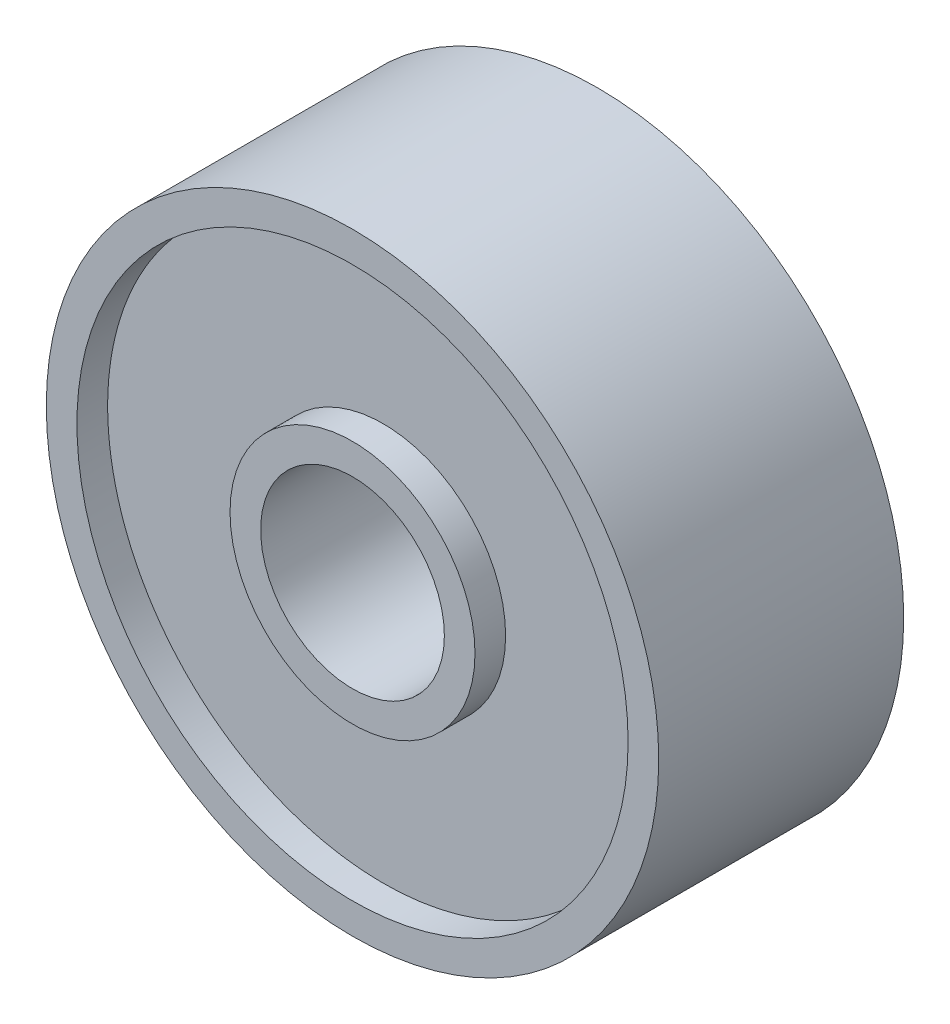
ISO-10303-21;
HEADER;
FILE_DESCRIPTION(('STEP AP214'),'2;1');
FILE_NAME('part.step','',(''),(''),'','','');
FILE_SCHEMA(('AUTOMOTIVE_DESIGN { 1 0 10303 214 1 1 1 1 }'));
ENDSEC;
DATA;
#1=APPLICATION_CONTEXT('core data for automotive mechanical design processes');
#2=APPLICATION_PROTOCOL_DEFINITION('international standard','automotive_design',2000,#1);
#3=PRODUCT_CONTEXT('',#1,'mechanical');
#4=PRODUCT('Part','Part','',(#3));
#5=PRODUCT_RELATED_PRODUCT_CATEGORY('part','',(#4));
#6=PRODUCT_DEFINITION_FORMATION('','',#4);
#7=PRODUCT_DEFINITION_CONTEXT('part definition',#1,'design');
#8=PRODUCT_DEFINITION('design','',#6,#7);
#9=PRODUCT_DEFINITION_SHAPE('','',#8);
#10=(LENGTH_UNIT() NAMED_UNIT(*) SI_UNIT(.MILLI.,.METRE.));
#11=(NAMED_UNIT(*) PLANE_ANGLE_UNIT() SI_UNIT($,.RADIAN.));
#12=(NAMED_UNIT(*) SI_UNIT($,.STERADIAN.) SOLID_ANGLE_UNIT());
#13=UNCERTAINTY_MEASURE_WITH_UNIT(LENGTH_MEASURE(1.E-05),#10,'distance_accuracy_value','');
#14=(GEOMETRIC_REPRESENTATION_CONTEXT(3) GLOBAL_UNCERTAINTY_ASSIGNED_CONTEXT((#13)) GLOBAL_UNIT_ASSIGNED_CONTEXT((#10,
#11,#12)) REPRESENTATION_CONTEXT('',''));
#15=CARTESIAN_POINT('',(0.,0.,0.));
#16=DIRECTION('',(0.,0.,1.));
#17=DIRECTION('',(1.,0.,0.));
#18=AXIS2_PLACEMENT_3D('',#15,#16,#17);
#19=CARTESIAN_POINT('',(0.,0.,4.));
#20=DIRECTION('',(0.,0.,-1.));
#21=DIRECTION('',(-1.,0.,0.));
#22=AXIS2_PLACEMENT_3D('',#19,#20,#21);
#23=CYLINDRICAL_SURFACE('',#22,2.);
#24=CARTESIAN_POINT('',(0.,0.,0.499988));
#25=DIRECTION('',(0.,0.,-1.));
#26=DIRECTION('',(-1.,0.,0.));
#27=AXIS2_PLACEMENT_3D('',#24,#25,#26);
#28=CIRCLE('',#27,2.);
#29=CARTESIAN_POINT('',(-2.,0.,0.499988));
#30=VERTEX_POINT('',#29);
#31=EDGE_CURVE('E12',#30,#30,#28,.F.);
#32=ORIENTED_EDGE('',*,*,#31,.F.);
#33=EDGE_LOOP('',(#32));
#34=FACE_BOUND('',#33,.T.);
#35=CARTESIAN_POINT('',(0.,0.,3.5));
#36=DIRECTION('',(0.,0.,1.));
#37=DIRECTION('',(1.,0.,0.));
#38=AXIS2_PLACEMENT_3D('',#35,#36,#37);
#39=CIRCLE('',#38,2.);
#40=CARTESIAN_POINT('',(2.,0.,3.5));
#41=VERTEX_POINT('',#40);
#42=EDGE_CURVE('E63',#41,#41,#39,.F.);
#43=ORIENTED_EDGE('',*,*,#42,.F.);
#44=EDGE_LOOP('',(#43));
#45=FACE_BOUND('',#44,.T.);
#46=ADVANCED_FACE('F53',(#34,#45),#23,.F.);
#47=CARTESIAN_POINT('',(0.,0.,4.));
#48=DIRECTION('',(0.,0.,-1.));
#49=DIRECTION('',(-1.,0.,0.));
#50=AXIS2_PLACEMENT_3D('',#47,#48,#49);
#51=CYLINDRICAL_SURFACE('',#50,4.5);
#52=CARTESIAN_POINT('',(0.,0.,0.499988));
#53=DIRECTION('',(0.,0.,-1.));
#54=DIRECTION('',(-1.,0.,0.));
#55=AXIS2_PLACEMENT_3D('',#52,#53,#54);
#56=CIRCLE('',#55,4.5);
#57=CARTESIAN_POINT('',(-4.5,0.,0.499988));
#58=VERTEX_POINT('',#57);
#59=EDGE_CURVE('E59',#58,#58,#56,.T.);
#60=ORIENTED_EDGE('',*,*,#59,.F.);
#61=EDGE_LOOP('',(#60));
#62=FACE_BOUND('',#61,.T.);
#63=CARTESIAN_POINT('',(0.,0.,3.5));
#64=DIRECTION('',(0.,0.,1.));
#65=DIRECTION('',(1.,0.,0.));
#66=AXIS2_PLACEMENT_3D('',#63,#64,#65);
#67=CIRCLE('',#66,4.5);
#68=CARTESIAN_POINT('',(4.5,0.,3.5));
#69=VERTEX_POINT('',#68);
#70=EDGE_CURVE('E67',#69,#69,#67,.T.);
#71=ORIENTED_EDGE('',*,*,#70,.F.);
#72=EDGE_LOOP('',(#71));
#73=FACE_BOUND('',#72,.T.);
#74=ADVANCED_FACE('F76',(#62,#73),#51,.T.);
#75=CARTESIAN_POINT('',(0.,0.,0.499988));
#76=DIRECTION('',(0.,0.,-1.));
#77=DIRECTION('',(-1.,0.,0.));
#78=AXIS2_PLACEMENT_3D('',#75,#76,#77);
#79=PLANE('',#78);
#80=ORIENTED_EDGE('',*,*,#59,.T.);
#81=EDGE_LOOP('',(#80));
#82=FACE_BOUND('',#81,.T.);
#83=ORIENTED_EDGE('',*,*,#31,.T.);
#84=EDGE_LOOP('',(#83));
#85=FACE_BOUND('',#84,.T.);
#86=ADVANCED_FACE('F78',(#82,#85),#79,.T.);
#87=CARTESIAN_POINT('',(0.,0.,3.5));
#88=DIRECTION('',(0.,0.,1.));
#89=DIRECTION('',(1.,0.,0.));
#90=AXIS2_PLACEMENT_3D('',#87,#88,#89);
#91=PLANE('',#90);
#92=ORIENTED_EDGE('',*,*,#70,.T.);
#93=EDGE_LOOP('',(#92));
#94=FACE_BOUND('',#93,.T.);
#95=ORIENTED_EDGE('',*,*,#42,.T.);
#96=EDGE_LOOP('',(#95));
#97=FACE_BOUND('',#96,.T.);
#98=ADVANCED_FACE('F73',(#94,#97),#91,.T.);
#99=CLOSED_SHELL('',(#46,#74,#86,#98));
#100=MANIFOLD_SOLID_BREP('B2',#99);
#101=CARTESIAN_POINT('',(0.,0.,4.));
#102=DIRECTION('',(0.,0.,-1.));
#103=DIRECTION('',(-1.,0.,0.));
#104=AXIS2_PLACEMENT_3D('',#101,#102,#103);
#105=CYLINDRICAL_SURFACE('',#104,1.5);
#106=CARTESIAN_POINT('',(0.,0.,4.));
#107=DIRECTION('',(0.,0.,1.));
#108=DIRECTION('',(1.,0.,0.));
#109=AXIS2_PLACEMENT_3D('',#106,#107,#108);
#110=CIRCLE('',#109,1.5);
#111=CARTESIAN_POINT('',(1.5,0.,4.));
#112=VERTEX_POINT('',#111);
#113=EDGE_CURVE('E132',#112,#112,#110,.T.);
#114=ORIENTED_EDGE('',*,*,#113,.T.);
#115=EDGE_LOOP('',(#114));
#116=FACE_BOUND('',#115,.T.);
#117=CARTESIAN_POINT('',(0.,0.,0.));
#118=DIRECTION('',(0.,0.,1.));
#119=DIRECTION('',(1.,0.,0.));
#120=AXIS2_PLACEMENT_3D('',#117,#118,#119);
#121=CIRCLE('',#120,1.5);
#122=CARTESIAN_POINT('',(1.5,0.,0.));
#123=VERTEX_POINT('',#122);
#124=EDGE_CURVE('E138',#123,#123,#121,.T.);
#125=ORIENTED_EDGE('',*,*,#124,.F.);
#126=EDGE_LOOP('',(#125));
#127=FACE_BOUND('',#126,.T.);
#128=ADVANCED_FACE('F125',(#116,#127),#105,.F.);
#129=CARTESIAN_POINT('',(0.,0.,4.));
#130=DIRECTION('',(0.,0.,-1.));
#131=DIRECTION('',(-1.,0.,0.));
#132=AXIS2_PLACEMENT_3D('',#129,#130,#131);
#133=CYLINDRICAL_SURFACE('',#132,2.);
#134=CARTESIAN_POINT('',(0.,0.,4.));
#135=DIRECTION('',(0.,0.,1.));
#136=DIRECTION('',(1.,0.,0.));
#137=AXIS2_PLACEMENT_3D('',#134,#135,#136);
#138=CIRCLE('',#137,2.);
#139=CARTESIAN_POINT('',(2.,0.,4.));
#140=VERTEX_POINT('',#139);
#141=EDGE_CURVE('E52',#140,#140,#138,.T.);
#142=ORIENTED_EDGE('',*,*,#141,.F.);
#143=EDGE_LOOP('',(#142));
#144=FACE_BOUND('',#143,.T.);
#145=CARTESIAN_POINT('',(0.,0.,0.));
#146=DIRECTION('',(0.,0.,1.));
#147=DIRECTION('',(1.,0.,0.));
#148=AXIS2_PLACEMENT_3D('',#145,#146,#147);
#149=CIRCLE('',#148,2.);
#150=CARTESIAN_POINT('',(2.,0.,0.));
#151=VERTEX_POINT('',#150);
#152=EDGE_CURVE('E128',#151,#151,#149,.T.);
#153=ORIENTED_EDGE('',*,*,#152,.T.);
#154=EDGE_LOOP('',(#153));
#155=FACE_BOUND('',#154,.T.);
#156=ADVANCED_FACE('F145',(#144,#155),#133,.T.);
#157=CARTESIAN_POINT('',(0.,0.,4.));
#158=DIRECTION('',(0.,0.,1.));
#159=DIRECTION('',(1.,0.,0.));
#160=AXIS2_PLACEMENT_3D('',#157,#158,#159);
#161=PLANE('',#160);
#162=ORIENTED_EDGE('',*,*,#113,.F.);
#163=EDGE_LOOP('',(#162));
#164=FACE_BOUND('',#163,.T.);
#165=ORIENTED_EDGE('',*,*,#141,.T.);
#166=EDGE_LOOP('',(#165));
#167=FACE_BOUND('',#166,.T.);
#168=ADVANCED_FACE('F149',(#164,#167),#161,.T.);
#169=CARTESIAN_POINT('',(0.,0.,0.));
#170=DIRECTION('',(0.,0.,1.));
#171=DIRECTION('',(1.,0.,0.));
#172=AXIS2_PLACEMENT_3D('',#169,#170,#171);
#173=PLANE('',#172);
#174=ORIENTED_EDGE('',*,*,#124,.T.);
#175=EDGE_LOOP('',(#174));
#176=FACE_BOUND('',#175,.T.);
#177=ORIENTED_EDGE('',*,*,#152,.F.);
#178=EDGE_LOOP('',(#177));
#179=FACE_BOUND('',#178,.T.);
#180=ADVANCED_FACE('F147',(#176,#179),#173,.F.);
#181=CLOSED_SHELL('',(#128,#156,#168,#180));
#182=MANIFOLD_SOLID_BREP('B7',#181);
#183=CARTESIAN_POINT('',(0.,0.,4.));
#184=DIRECTION('',(0.,0.,-1.));
#185=DIRECTION('',(-1.,0.,0.));
#186=AXIS2_PLACEMENT_3D('',#183,#184,#185);
#187=CYLINDRICAL_SURFACE('',#186,4.5);
#188=CARTESIAN_POINT('',(0.,0.,4.));
#189=DIRECTION('',(0.,0.,1.));
#190=DIRECTION('',(1.,0.,0.));
#191=AXIS2_PLACEMENT_3D('',#188,#189,#190);
#192=CIRCLE('',#191,4.5);
#193=CARTESIAN_POINT('',(4.5,0.,4.));
#194=VERTEX_POINT('',#193);
#195=EDGE_CURVE('E193',#194,#194,#192,.T.);
#196=ORIENTED_EDGE('',*,*,#195,.T.);
#197=EDGE_LOOP('',(#196));
#198=FACE_BOUND('',#197,.T.);
#199=CARTESIAN_POINT('',(0.,0.,0.));
#200=DIRECTION('',(0.,0.,1.));
#201=DIRECTION('',(1.,0.,0.));
#202=AXIS2_PLACEMENT_3D('',#199,#200,#201);
#203=CIRCLE('',#202,4.5);
#204=CARTESIAN_POINT('',(4.5,0.,0.));
#205=VERTEX_POINT('',#204);
#206=EDGE_CURVE('E199',#205,#205,#203,.T.);
#207=ORIENTED_EDGE('',*,*,#206,.F.);
#208=EDGE_LOOP('',(#207));
#209=FACE_BOUND('',#208,.T.);
#210=ADVANCED_FACE('F186',(#198,#209),#187,.F.);
#211=CARTESIAN_POINT('',(0.,0.,4.));
#212=DIRECTION('',(0.,0.,-1.));
#213=DIRECTION('',(-1.,0.,0.));
#214=AXIS2_PLACEMENT_3D('',#211,#212,#213);
#215=CYLINDRICAL_SURFACE('',#214,5.);
#216=CARTESIAN_POINT('',(0.,0.,4.));
#217=DIRECTION('',(0.,0.,1.));
#218=DIRECTION('',(1.,0.,0.));
#219=AXIS2_PLACEMENT_3D('',#216,#217,#218);
#220=CIRCLE('',#219,5.);
#221=CARTESIAN_POINT('',(5.,0.,4.));
#222=VERTEX_POINT('',#221);
#223=EDGE_CURVE('E124',#222,#222,#220,.T.);
#224=ORIENTED_EDGE('',*,*,#223,.F.);
#225=EDGE_LOOP('',(#224));
#226=FACE_BOUND('',#225,.T.);
#227=CARTESIAN_POINT('',(0.,0.,0.));
#228=DIRECTION('',(0.,0.,1.));
#229=DIRECTION('',(1.,0.,0.));
#230=AXIS2_PLACEMENT_3D('',#227,#228,#229);
#231=CIRCLE('',#230,5.);
#232=CARTESIAN_POINT('',(5.,0.,0.));
#233=VERTEX_POINT('',#232);
#234=EDGE_CURVE('E189',#233,#233,#231,.T.);
#235=ORIENTED_EDGE('',*,*,#234,.T.);
#236=EDGE_LOOP('',(#235));
#237=FACE_BOUND('',#236,.T.);
#238=ADVANCED_FACE('F206',(#226,#237),#215,.T.);
#239=CARTESIAN_POINT('',(0.,0.,4.));
#240=DIRECTION('',(0.,0.,1.));
#241=DIRECTION('',(1.,0.,0.));
#242=AXIS2_PLACEMENT_3D('',#239,#240,#241);
#243=PLANE('',#242);
#244=ORIENTED_EDGE('',*,*,#195,.F.);
#245=EDGE_LOOP('',(#244));
#246=FACE_BOUND('',#245,.T.);
#247=ORIENTED_EDGE('',*,*,#223,.T.);
#248=EDGE_LOOP('',(#247));
#249=FACE_BOUND('',#248,.T.);
#250=ADVANCED_FACE('F210',(#246,#249),#243,.T.);
#251=CARTESIAN_POINT('',(0.,0.,0.));
#252=DIRECTION('',(0.,0.,1.));
#253=DIRECTION('',(1.,0.,0.));
#254=AXIS2_PLACEMENT_3D('',#251,#252,#253);
#255=PLANE('',#254);
#256=ORIENTED_EDGE('',*,*,#206,.T.);
#257=EDGE_LOOP('',(#256));
#258=FACE_BOUND('',#257,.T.);
#259=ORIENTED_EDGE('',*,*,#234,.F.);
#260=EDGE_LOOP('',(#259));
#261=FACE_BOUND('',#260,.T.);
#262=ADVANCED_FACE('F208',(#258,#261),#255,.F.);
#263=CLOSED_SHELL('',(#210,#238,#250,#262));
#264=MANIFOLD_SOLID_BREP('B47',#263);
#265=ADVANCED_BREP_SHAPE_REPRESENTATION('',(#18,#100,#182,#264),#14);
#266=SHAPE_DEFINITION_REPRESENTATION(#9,#265);
ENDSEC;
END-ISO-10303-21;
